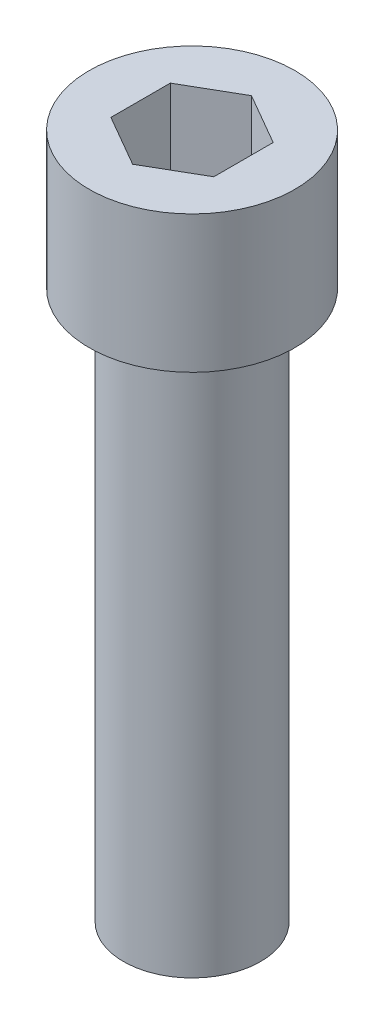
ISO-10303-21;
HEADER;
FILE_DESCRIPTION(('STEP AP214'),'2;1');
FILE_NAME('part.step','',(''),(''),'','','');
FILE_SCHEMA(('AUTOMOTIVE_DESIGN { 1 0 10303 214 1 1 1 1 }'));
ENDSEC;
DATA;
#1=APPLICATION_CONTEXT('core data for automotive mechanical design processes');
#2=APPLICATION_PROTOCOL_DEFINITION('international standard','automotive_design',2000,#1);
#3=PRODUCT_CONTEXT('',#1,'mechanical');
#4=PRODUCT('Part','Part','',(#3));
#5=PRODUCT_RELATED_PRODUCT_CATEGORY('part','',(#4));
#6=PRODUCT_DEFINITION_FORMATION('','',#4);
#7=PRODUCT_DEFINITION_CONTEXT('part definition',#1,'design');
#8=PRODUCT_DEFINITION('design','',#6,#7);
#9=PRODUCT_DEFINITION_SHAPE('','',#8);
#10=(LENGTH_UNIT() NAMED_UNIT(*) SI_UNIT(.MILLI.,.METRE.));
#11=(NAMED_UNIT(*) PLANE_ANGLE_UNIT() SI_UNIT($,.RADIAN.));
#12=(NAMED_UNIT(*) SI_UNIT($,.STERADIAN.) SOLID_ANGLE_UNIT());
#13=UNCERTAINTY_MEASURE_WITH_UNIT(LENGTH_MEASURE(1.E-05),#10,'distance_accuracy_value','');
#14=(GEOMETRIC_REPRESENTATION_CONTEXT(3) GLOBAL_UNCERTAINTY_ASSIGNED_CONTEXT((#13)) GLOBAL_UNIT_ASSIGNED_CONTEXT((#10,
#11,#12)) REPRESENTATION_CONTEXT('',''));
#15=CARTESIAN_POINT('',(0.,0.,0.));
#16=DIRECTION('',(0.,0.,1.));
#17=DIRECTION('',(1.,0.,0.));
#18=AXIS2_PLACEMENT_3D('',#15,#16,#17);
#19=CARTESIAN_POINT('',(-3.175,-25.4,-3.2385));
#20=DIRECTION('',(0.,-1.,0.));
#21=DIRECTION('',(1.,0.,0.));
#22=AXIS2_PLACEMENT_3D('',#19,#20,#21);
#23=PLANE('',#22);
#24=CARTESIAN_POINT('',(0.,-25.4,0.));
#25=DIRECTION('',(0.,-1.,0.));
#26=DIRECTION('',(0.,0.,-1.));
#27=AXIS2_PLACEMENT_3D('',#24,#25,#26);
#28=CIRCLE('',#27,3.175);
#29=CARTESIAN_POINT('',(0.,-25.4,-3.175));
#30=VERTEX_POINT('',#29);
#31=EDGE_CURVE('E21',#30,#30,#28,.F.);
#32=ORIENTED_EDGE('',*,*,#31,.F.);
#33=EDGE_LOOP('',(#32));
#34=FACE_BOUND('',#33,.T.);
#35=ADVANCED_FACE('F17',(#34),#23,.T.);
#36=CARTESIAN_POINT('',(-2.38125,1.5875,-2.7496306570156));
#37=DIRECTION('',(0.,1.,0.));
#38=DIRECTION('',(0.,0.,1.));
#39=AXIS2_PLACEMENT_3D('',#36,#37,#38);
#40=PLANE('',#39);
#41=DIRECTION('',(0.,0.,1.));
#42=VECTOR('',#41,1.);
#43=CARTESIAN_POINT('',(2.38125,1.5875,0.));
#44=LINE('',#43,#42);
#45=CARTESIAN_POINT('',(2.38125,1.5875,-1.3748153285078));
#46=VERTEX_POINT('',#45);
#47=CARTESIAN_POINT('',(2.38125,1.5875,1.3748153285078));
#48=VERTEX_POINT('',#47);
#49=EDGE_CURVE('E76',#46,#48,#44,.T.);
#50=ORIENTED_EDGE('',*,*,#49,.F.);
#51=DIRECTION('',(0.866025403784438,0.,0.5));
#52=VECTOR('',#51,1.);
#53=CARTESIAN_POINT('',(1.190625,1.5875,-2.0622229927617));
#54=LINE('',#53,#52);
#55=CARTESIAN_POINT('',(-2.4999999549645E-09,1.5875,-2.74963065557222));
#56=VERTEX_POINT('',#55);
#57=EDGE_CURVE('E78',#56,#46,#54,.T.);
#58=ORIENTED_EDGE('',*,*,#57,.F.);
#59=DIRECTION('',(0.866025403784438,0.,-0.5));
#60=VECTOR('',#59,1.);
#61=CARTESIAN_POINT('',(-1.190625,1.5875,-2.0622229927617));
#62=LINE('',#61,#60);
#63=CARTESIAN_POINT('',(-2.38125,1.5875,-1.3748153285078));
#64=VERTEX_POINT('',#63);
#65=EDGE_CURVE('E65',#64,#56,#62,.T.);
#66=ORIENTED_EDGE('',*,*,#65,.F.);
#67=DIRECTION('',(0.,0.,-1.));
#68=VECTOR('',#67,1.);
#69=CARTESIAN_POINT('',(-2.38125,1.5875,0.));
#70=LINE('',#69,#68);
#71=CARTESIAN_POINT('',(-2.38125,1.5875,1.3748153285078));
#72=VERTEX_POINT('',#71);
#73=EDGE_CURVE('E124',#72,#64,#70,.T.);
#74=ORIENTED_EDGE('',*,*,#73,.F.);
#75=DIRECTION('',(-0.866025403784438,0.,-0.5));
#76=VECTOR('',#75,1.);
#77=CARTESIAN_POINT('',(-1.190625,1.5875,2.0622229927617));
#78=LINE('',#77,#76);
#79=CARTESIAN_POINT('',(-2.4999999549645E-09,1.5875,2.74963065557222));
#80=VERTEX_POINT('',#79);
#81=EDGE_CURVE('E107',#80,#72,#78,.T.);
#82=ORIENTED_EDGE('',*,*,#81,.F.);
#83=DIRECTION('',(-0.866025403784438,0.,0.5));
#84=VECTOR('',#83,1.);
#85=CARTESIAN_POINT('',(1.190625,1.5875,2.0622229927617));
#86=LINE('',#85,#84);
#87=EDGE_CURVE('E100',#48,#80,#86,.T.);
#88=ORIENTED_EDGE('',*,*,#87,.F.);
#89=EDGE_LOOP('',(#50,#58,#66,#74,#82,#88));
#90=FACE_BOUND('',#89,.T.);
#91=ADVANCED_FACE('F79',(#90),#40,.T.);
#92=CARTESIAN_POINT('',(0.,0.,0.));
#93=DIRECTION('',(0.,-1.,0.));
#94=DIRECTION('',(0.,0.,-1.));
#95=AXIS2_PLACEMENT_3D('',#92,#93,#94);
#96=CYLINDRICAL_SURFACE('',#95,3.175);
#97=CARTESIAN_POINT('',(0.,0.,0.));
#98=DIRECTION('',(0.,-1.,0.));
#99=DIRECTION('',(0.,0.,-1.));
#100=AXIS2_PLACEMENT_3D('',#97,#98,#99);
#101=CIRCLE('',#100,3.175);
#102=CARTESIAN_POINT('',(0.,0.,-3.175));
#103=VERTEX_POINT('',#102);
#104=EDGE_CURVE('E118',#103,#103,#101,.F.);
#105=ORIENTED_EDGE('',*,*,#104,.F.);
#106=EDGE_LOOP('',(#105));
#107=FACE_BOUND('',#106,.T.);
#108=ORIENTED_EDGE('',*,*,#31,.T.);
#109=EDGE_LOOP('',(#108));
#110=FACE_BOUND('',#109,.T.);
#111=ADVANCED_FACE('F226',(#107,#110),#96,.T.);
#112=CARTESIAN_POINT('',(0.,6.35,-2.7496306570156));
#113=DIRECTION('',(0.5,0.,0.866025403784438));
#114=DIRECTION('',(-0.866025403784438,0.,0.5));
#115=AXIS2_PLACEMENT_3D('',#112,#113,#114);
#116=PLANE('',#115);
#117=DIRECTION('',(0.866025403784438,0.,-0.5));
#118=VECTOR('',#117,1.);
#119=CARTESIAN_POINT('',(-2.38125,6.35,-1.3748153285078));
#120=LINE('',#119,#118);
#121=CARTESIAN_POINT('',(-2.38125,6.35,-1.3748153285078));
#122=VERTEX_POINT('',#121);
#123=CARTESIAN_POINT('',(0.,6.35,-2.7496306570156));
#124=VERTEX_POINT('',#123);
#125=EDGE_CURVE('E56',#122,#124,#120,.T.);
#126=ORIENTED_EDGE('',*,*,#125,.F.);
#127=DIRECTION('',(0.,1.,0.));
#128=VECTOR('',#127,1.);
#129=CARTESIAN_POINT('',(-2.38125,3.96875,-1.3748153285078));
#130=LINE('',#129,#128);
#131=EDGE_CURVE('E87',#64,#122,#130,.T.);
#132=ORIENTED_EDGE('',*,*,#131,.F.);
#133=ORIENTED_EDGE('',*,*,#65,.T.);
#134=DIRECTION('',(0.,-1.,0.));
#135=VECTOR('',#134,1.);
#136=CARTESIAN_POINT('',(0.,3.96875,-2.7496306570156));
#137=LINE('',#136,#135);
#138=EDGE_CURVE('E83',#124,#56,#137,.T.);
#139=ORIENTED_EDGE('',*,*,#138,.F.);
#140=EDGE_LOOP('',(#126,#132,#133,#139));
#141=FACE_BOUND('',#140,.T.);
#142=ADVANCED_FACE('F85',(#141),#116,.T.);
#143=CARTESIAN_POINT('',(2.38125,6.35,-1.3748153285078));
#144=DIRECTION('',(-0.5,0.,0.866025403784438));
#145=DIRECTION('',(-0.866025403784438,0.,-0.5));
#146=AXIS2_PLACEMENT_3D('',#143,#144,#145);
#147=PLANE('',#146);
#148=DIRECTION('',(0.866025403784438,0.,0.5));
#149=VECTOR('',#148,1.);
#150=CARTESIAN_POINT('',(0.,6.35,-2.7496306570156));
#151=LINE('',#150,#149);
#152=CARTESIAN_POINT('',(2.38125,6.35,-1.3748153285078));
#153=VERTEX_POINT('',#152);
#154=EDGE_CURVE('E92',#124,#153,#151,.T.);
#155=ORIENTED_EDGE('',*,*,#154,.F.);
#156=ORIENTED_EDGE('',*,*,#138,.T.);
#157=ORIENTED_EDGE('',*,*,#57,.T.);
#158=DIRECTION('',(0.,-1.,0.));
#159=VECTOR('',#158,1.);
#160=CARTESIAN_POINT('',(2.38125,3.96875,-1.3748153285078));
#161=LINE('',#160,#159);
#162=EDGE_CURVE('E94',#153,#46,#161,.T.);
#163=ORIENTED_EDGE('',*,*,#162,.F.);
#164=EDGE_LOOP('',(#155,#156,#157,#163));
#165=FACE_BOUND('',#164,.T.);
#166=ADVANCED_FACE('F90',(#165),#147,.T.);
#167=CARTESIAN_POINT('',(2.38125,6.35,1.3748153285078));
#168=DIRECTION('',(-1.,0.,0.));
#169=DIRECTION('',(0.,0.,-1.));
#170=AXIS2_PLACEMENT_3D('',#167,#168,#169);
#171=PLANE('',#170);
#172=DIRECTION('',(0.,0.,1.));
#173=VECTOR('',#172,1.);
#174=CARTESIAN_POINT('',(2.38125,6.35,0.));
#175=LINE('',#174,#173);
#176=CARTESIAN_POINT('',(2.38125,6.35,1.3748153285078));
#177=VERTEX_POINT('',#176);
#178=EDGE_CURVE('E101',#153,#177,#175,.T.);
#179=ORIENTED_EDGE('',*,*,#178,.F.);
#180=ORIENTED_EDGE('',*,*,#162,.T.);
#181=ORIENTED_EDGE('',*,*,#49,.T.);
#182=DIRECTION('',(0.,-1.,0.));
#183=VECTOR('',#182,1.);
#184=CARTESIAN_POINT('',(2.38125,3.96875,1.3748153285078));
#185=LINE('',#184,#183);
#186=EDGE_CURVE('E105',#177,#48,#185,.T.);
#187=ORIENTED_EDGE('',*,*,#186,.F.);
#188=EDGE_LOOP('',(#179,#180,#181,#187));
#189=FACE_BOUND('',#188,.T.);
#190=ADVANCED_FACE('F142',(#189),#171,.T.);
#191=CARTESIAN_POINT('',(0.,6.35,2.7496306570156));
#192=DIRECTION('',(-0.5,0.,-0.866025403784438));
#193=DIRECTION('',(0.866025403784438,0.,-0.5));
#194=AXIS2_PLACEMENT_3D('',#191,#192,#193);
#195=PLANE('',#194);
#196=DIRECTION('',(-0.866025403784438,0.,0.5));
#197=VECTOR('',#196,1.);
#198=CARTESIAN_POINT('',(2.38125,6.35,1.3748153285078));
#199=LINE('',#198,#197);
#200=CARTESIAN_POINT('',(0.,6.35,2.7496306570156));
#201=VERTEX_POINT('',#200);
#202=EDGE_CURVE('E104',#177,#201,#199,.T.);
#203=ORIENTED_EDGE('',*,*,#202,.F.);
#204=ORIENTED_EDGE('',*,*,#186,.T.);
#205=ORIENTED_EDGE('',*,*,#87,.T.);
#206=DIRECTION('',(0.,-1.,0.));
#207=VECTOR('',#206,1.);
#208=CARTESIAN_POINT('',(0.,3.96875,2.7496306570156));
#209=LINE('',#208,#207);
#210=EDGE_CURVE('E126',#201,#80,#209,.T.);
#211=ORIENTED_EDGE('',*,*,#210,.F.);
#212=EDGE_LOOP('',(#203,#204,#205,#211));
#213=FACE_BOUND('',#212,.T.);
#214=ADVANCED_FACE('F138',(#213),#195,.T.);
#215=CARTESIAN_POINT('',(-2.38125,6.35,1.3748153285078));
#216=DIRECTION('',(0.5,0.,-0.866025403784438));
#217=DIRECTION('',(0.866025403784438,0.,0.5));
#218=AXIS2_PLACEMENT_3D('',#215,#216,#217);
#219=PLANE('',#218);
#220=DIRECTION('',(-0.866025403784438,0.,-0.5));
#221=VECTOR('',#220,1.);
#222=CARTESIAN_POINT('',(0.,6.35,2.7496306570156));
#223=LINE('',#222,#221);
#224=CARTESIAN_POINT('',(-2.38125,6.35,1.3748153285078));
#225=VERTEX_POINT('',#224);
#226=EDGE_CURVE('E112',#201,#225,#223,.T.);
#227=ORIENTED_EDGE('',*,*,#226,.F.);
#228=ORIENTED_EDGE('',*,*,#210,.T.);
#229=ORIENTED_EDGE('',*,*,#81,.T.);
#230=DIRECTION('',(0.,-1.,0.));
#231=VECTOR('',#230,1.);
#232=CARTESIAN_POINT('',(-2.38125,3.96875,1.3748153285078));
#233=LINE('',#232,#231);
#234=EDGE_CURVE('E36',#225,#72,#233,.T.);
#235=ORIENTED_EDGE('',*,*,#234,.F.);
#236=EDGE_LOOP('',(#227,#228,#229,#235));
#237=FACE_BOUND('',#236,.T.);
#238=ADVANCED_FACE('F139',(#237),#219,.T.);
#239=CARTESIAN_POINT('',(-2.38125,6.35,-1.3748153285078));
#240=DIRECTION('',(1.,0.,0.));
#241=DIRECTION('',(0.,0.,1.));
#242=AXIS2_PLACEMENT_3D('',#239,#240,#241);
#243=PLANE('',#242);
#244=DIRECTION('',(0.,0.,-1.));
#245=VECTOR('',#244,1.);
#246=CARTESIAN_POINT('',(-2.38125,6.35,0.));
#247=LINE('',#246,#245);
#248=EDGE_CURVE('E111',#225,#122,#247,.T.);
#249=ORIENTED_EDGE('',*,*,#248,.F.);
#250=ORIENTED_EDGE('',*,*,#234,.T.);
#251=ORIENTED_EDGE('',*,*,#73,.T.);
#252=ORIENTED_EDGE('',*,*,#131,.T.);
#253=EDGE_LOOP('',(#249,#250,#251,#252));
#254=FACE_BOUND('',#253,.T.);
#255=ADVANCED_FACE('F130',(#254),#243,.T.);
#256=CARTESIAN_POINT('',(-4.7625,0.,-4.85775));
#257=DIRECTION('',(0.,-1.,0.));
#258=DIRECTION('',(1.,0.,0.));
#259=AXIS2_PLACEMENT_3D('',#256,#257,#258);
#260=PLANE('',#259);
#261=ORIENTED_EDGE('',*,*,#104,.T.);
#262=EDGE_LOOP('',(#261));
#263=FACE_BOUND('',#262,.T.);
#264=CARTESIAN_POINT('',(0.,0.,0.));
#265=DIRECTION('',(0.,-1.,0.));
#266=DIRECTION('',(0.,0.,-1.));
#267=AXIS2_PLACEMENT_3D('',#264,#265,#266);
#268=CIRCLE('',#267,4.7625);
#269=CARTESIAN_POINT('',(0.,0.,-4.7625));
#270=VERTEX_POINT('',#269);
#271=EDGE_CURVE('E27',#270,#270,#268,.F.);
#272=ORIENTED_EDGE('',*,*,#271,.F.);
#273=EDGE_LOOP('',(#272));
#274=FACE_BOUND('',#273,.T.);
#275=ADVANCED_FACE('F159',(#263,#274),#260,.T.);
#276=CARTESIAN_POINT('',(4.7625,6.35,-4.85775));
#277=DIRECTION('',(0.,1.,0.));
#278=DIRECTION('',(-1.,0.,0.));
#279=AXIS2_PLACEMENT_3D('',#276,#277,#278);
#280=PLANE('',#279);
#281=CARTESIAN_POINT('',(0.,6.35,0.));
#282=DIRECTION('',(0.,-1.,0.));
#283=DIRECTION('',(0.,0.,-1.));
#284=AXIS2_PLACEMENT_3D('',#281,#282,#283);
#285=CIRCLE('',#284,4.7625);
#286=CARTESIAN_POINT('',(0.,6.35,-4.7625));
#287=VERTEX_POINT('',#286);
#288=EDGE_CURVE('E11',#287,#287,#285,.T.);
#289=ORIENTED_EDGE('',*,*,#288,.F.);
#290=EDGE_LOOP('',(#289));
#291=FACE_BOUND('',#290,.T.);
#292=ORIENTED_EDGE('',*,*,#226,.T.);
#293=ORIENTED_EDGE('',*,*,#248,.T.);
#294=ORIENTED_EDGE('',*,*,#125,.T.);
#295=ORIENTED_EDGE('',*,*,#154,.T.);
#296=ORIENTED_EDGE('',*,*,#178,.T.);
#297=ORIENTED_EDGE('',*,*,#202,.T.);
#298=EDGE_LOOP('',(#292,#293,#294,#295,#296,#297));
#299=FACE_BOUND('',#298,.T.);
#300=ADVANCED_FACE('F129',(#291,#299),#280,.T.);
#301=CARTESIAN_POINT('',(0.,6.35,0.));
#302=DIRECTION('',(0.,-1.,0.));
#303=DIRECTION('',(0.,0.,-1.));
#304=AXIS2_PLACEMENT_3D('',#301,#302,#303);
#305=CYLINDRICAL_SURFACE('',#304,4.7625);
#306=ORIENTED_EDGE('',*,*,#271,.T.);
#307=EDGE_LOOP('',(#306));
#308=FACE_BOUND('',#307,.T.);
#309=ORIENTED_EDGE('',*,*,#288,.T.);
#310=EDGE_LOOP('',(#309));
#311=FACE_BOUND('',#310,.T.);
#312=ADVANCED_FACE('F19',(#308,#311),#305,.T.);
#313=CLOSED_SHELL('',(#35,#91,#111,#142,#166,#190,#214,#238,#255,#275,#300,#312));
#314=MANIFOLD_SOLID_BREP('B1',#313);
#315=ADVANCED_BREP_SHAPE_REPRESENTATION('',(#18,#314),#14);
#316=SHAPE_DEFINITION_REPRESENTATION(#9,#315);
ENDSEC;
END-ISO-10303-21;
